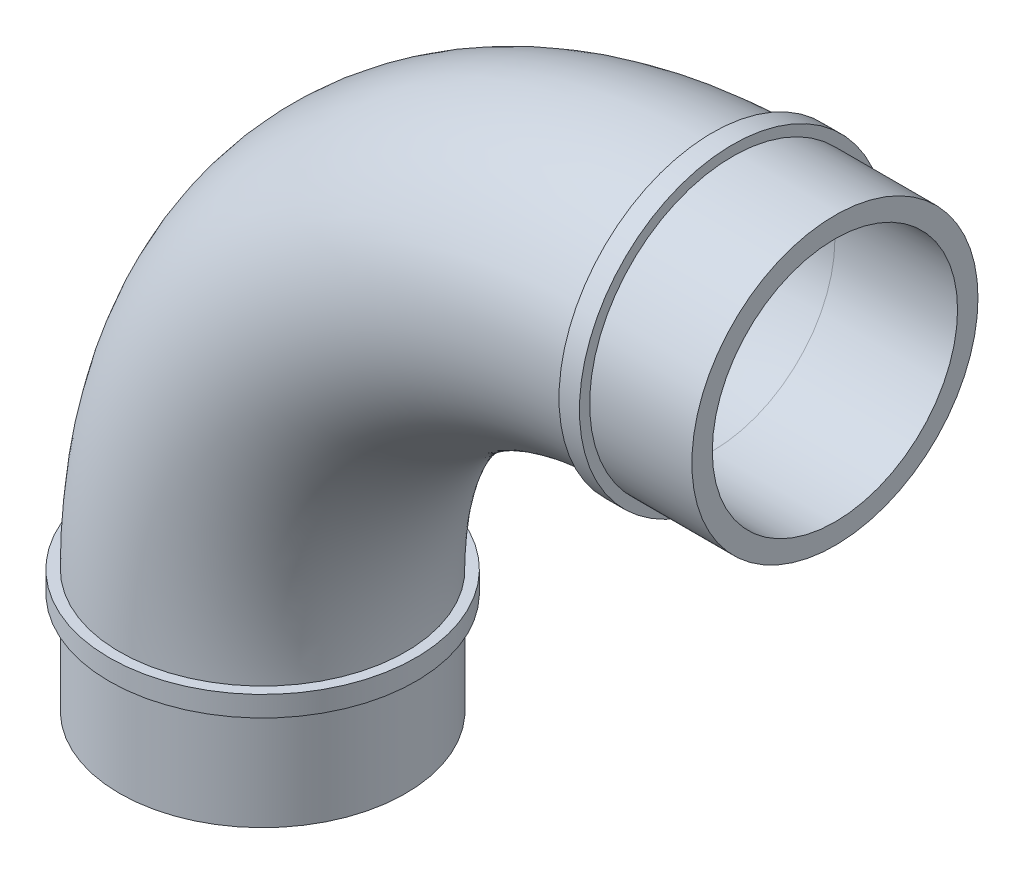
ISO-10303-21;
HEADER;
FILE_DESCRIPTION(('STEP AP214'),'2;1');
FILE_NAME('part.step','',(''),(''),'','','');
FILE_SCHEMA(('AUTOMOTIVE_DESIGN { 1 0 10303 214 1 1 1 1 }'));
ENDSEC;
DATA;
#1=APPLICATION_CONTEXT('core data for automotive mechanical design processes');
#2=APPLICATION_PROTOCOL_DEFINITION('international standard','automotive_design',2000,#1);
#3=PRODUCT_CONTEXT('',#1,'mechanical');
#4=PRODUCT('Part','Part','',(#3));
#5=PRODUCT_RELATED_PRODUCT_CATEGORY('part','',(#4));
#6=PRODUCT_DEFINITION_FORMATION('','',#4);
#7=PRODUCT_DEFINITION_CONTEXT('part definition',#1,'design');
#8=PRODUCT_DEFINITION('design','',#6,#7);
#9=PRODUCT_DEFINITION_SHAPE('','',#8);
#10=(LENGTH_UNIT() NAMED_UNIT(*) SI_UNIT(.MILLI.,.METRE.));
#11=(NAMED_UNIT(*) PLANE_ANGLE_UNIT() SI_UNIT($,.RADIAN.));
#12=(NAMED_UNIT(*) SI_UNIT($,.STERADIAN.) SOLID_ANGLE_UNIT());
#13=UNCERTAINTY_MEASURE_WITH_UNIT(LENGTH_MEASURE(1.E-05),#10,'distance_accuracy_value','');
#14=(GEOMETRIC_REPRESENTATION_CONTEXT(3) GLOBAL_UNCERTAINTY_ASSIGNED_CONTEXT((#13)) GLOBAL_UNIT_ASSIGNED_CONTEXT((#10,
#11,#12)) REPRESENTATION_CONTEXT('',''));
#15=CARTESIAN_POINT('',(0.,0.,0.));
#16=DIRECTION('',(0.,0.,1.));
#17=DIRECTION('',(1.,0.,0.));
#18=AXIS2_PLACEMENT_3D('',#15,#16,#17);
#19=CARTESIAN_POINT('',(0.,1.,0.));
#20=DIRECTION('',(0.,-1.,0.));
#21=DIRECTION('',(0.,0.,-1.));
#22=AXIS2_PLACEMENT_3D('',#19,#20,#21);
#23=CYLINDRICAL_SURFACE('',#22,7.);
#24=CARTESIAN_POINT('',(0.,0.,0.));
#25=DIRECTION('',(0.,1.,0.));
#26=DIRECTION('',(0.,0.,1.));
#27=AXIS2_PLACEMENT_3D('',#24,#25,#26);
#28=CIRCLE('',#27,7.);
#29=CARTESIAN_POINT('',(0.,0.,7.));
#30=VERTEX_POINT('',#29);
#31=EDGE_CURVE('E37',#30,#30,#28,.T.);
#32=ORIENTED_EDGE('',*,*,#31,.T.);
#33=EDGE_LOOP('',(#32));
#34=FACE_BOUND('',#33,.T.);
#35=CARTESIAN_POINT('',(0.,5.,0.));
#36=DIRECTION('',(0.,1.,0.));
#37=DIRECTION('',(0.,0.,1.));
#38=AXIS2_PLACEMENT_3D('',#35,#36,#37);
#39=CIRCLE('',#38,7.);
#40=CARTESIAN_POINT('',(0.,5.,7.));
#41=VERTEX_POINT('',#40);
#42=EDGE_CURVE('E64',#41,#41,#39,.T.);
#43=ORIENTED_EDGE('',*,*,#42,.F.);
#44=EDGE_LOOP('',(#43));
#45=FACE_BOUND('',#44,.T.);
#46=ADVANCED_FACE('F34',(#34,#45),#23,.T.);
#47=CARTESIAN_POINT('',(0.,0.,0.));
#48=DIRECTION('',(0.,1.,0.));
#49=DIRECTION('',(0.,0.,1.));
#50=AXIS2_PLACEMENT_3D('',#47,#48,#49);
#51=PLANE('',#50);
#52=CARTESIAN_POINT('',(0.,0.,0.));
#53=DIRECTION('',(0.,1.,0.));
#54=DIRECTION('',(0.,0.,1.));
#55=AXIS2_PLACEMENT_3D('',#52,#53,#54);
#56=CIRCLE('',#55,6.);
#57=CARTESIAN_POINT('',(0.,0.,6.));
#58=VERTEX_POINT('',#57);
#59=EDGE_CURVE('E131',#58,#58,#56,.F.);
#60=ORIENTED_EDGE('',*,*,#59,.F.);
#61=EDGE_LOOP('',(#60));
#62=FACE_BOUND('',#61,.T.);
#63=ORIENTED_EDGE('',*,*,#31,.F.);
#64=EDGE_LOOP('',(#63));
#65=FACE_BOUND('',#64,.T.);
#66=ADVANCED_FACE('F74',(#62,#65),#51,.F.);
#67=CARTESIAN_POINT('',(0.,6.,0.));
#68=DIRECTION('',(0.,-1.,0.));
#69=DIRECTION('',(0.,0.,-1.));
#70=AXIS2_PLACEMENT_3D('',#67,#68,#69);
#71=CYLINDRICAL_SURFACE('',#70,7.5);
#72=CARTESIAN_POINT('',(0.,6.,0.));
#73=DIRECTION('',(0.,1.,0.));
#74=DIRECTION('',(0.,0.,1.));
#75=AXIS2_PLACEMENT_3D('',#72,#73,#74);
#76=CIRCLE('',#75,7.5);
#77=CARTESIAN_POINT('',(0.,6.,7.5));
#78=VERTEX_POINT('',#77);
#79=EDGE_CURVE('E61',#78,#78,#76,.T.);
#80=ORIENTED_EDGE('',*,*,#79,.F.);
#81=EDGE_LOOP('',(#80));
#82=FACE_BOUND('',#81,.T.);
#83=CARTESIAN_POINT('',(0.,5.,0.));
#84=DIRECTION('',(0.,1.,0.));
#85=DIRECTION('',(0.,0.,1.));
#86=AXIS2_PLACEMENT_3D('',#83,#84,#85);
#87=CIRCLE('',#86,7.5);
#88=CARTESIAN_POINT('',(0.,5.,7.5));
#89=VERTEX_POINT('',#88);
#90=EDGE_CURVE('E60',#89,#89,#87,.T.);
#91=ORIENTED_EDGE('',*,*,#90,.T.);
#92=EDGE_LOOP('',(#91));
#93=FACE_BOUND('',#92,.T.);
#94=ADVANCED_FACE('F76',(#82,#93),#71,.T.);
#95=CARTESIAN_POINT('',(0.,6.,0.));
#96=DIRECTION('',(0.,1.,0.));
#97=DIRECTION('',(0.,0.,1.));
#98=AXIS2_PLACEMENT_3D('',#95,#96,#97);
#99=PLANE('',#98);
#100=CARTESIAN_POINT('',(0.,6.,0.));
#101=DIRECTION('',(0.,1.,0.));
#102=DIRECTION('',(0.,0.,1.));
#103=AXIS2_PLACEMENT_3D('',#100,#101,#102);
#104=CIRCLE('',#103,7.);
#105=CARTESIAN_POINT('',(-7.,6.,0.));
#106=VERTEX_POINT('',#105);
#107=EDGE_CURVE('E41',#106,#106,#104,.T.);
#108=ORIENTED_EDGE('',*,*,#107,.F.);
#109=EDGE_LOOP('',(#108));
#110=FACE_BOUND('',#109,.T.);
#111=ORIENTED_EDGE('',*,*,#79,.T.);
#112=EDGE_LOOP('',(#111));
#113=FACE_BOUND('',#112,.T.);
#114=ADVANCED_FACE('F82',(#110,#113),#99,.T.);
#115=CARTESIAN_POINT('',(0.,5.,0.));
#116=DIRECTION('',(0.,1.,0.));
#117=DIRECTION('',(0.,0.,1.));
#118=AXIS2_PLACEMENT_3D('',#115,#116,#117);
#119=PLANE('',#118);
#120=ORIENTED_EDGE('',*,*,#42,.T.);
#121=EDGE_LOOP('',(#120));
#122=FACE_BOUND('',#121,.T.);
#123=ORIENTED_EDGE('',*,*,#90,.F.);
#124=EDGE_LOOP('',(#123));
#125=FACE_BOUND('',#124,.T.);
#126=ADVANCED_FACE('F87',(#122,#125),#119,.F.);
#127=CARTESIAN_POINT('',(22.,6.,0.));
#128=DIRECTION('',(0.,0.,-1.));
#129=DIRECTION('',(-1.,0.,0.));
#130=AXIS2_PLACEMENT_3D('',#127,#128,#129);
#131=TOROIDAL_SURFACE('',#130,22.,7.);
#132=CARTESIAN_POINT('',(22.,28.,0.));
#133=DIRECTION('',(1.,0.,0.));
#134=DIRECTION('',(0.,0.,1.));
#135=AXIS2_PLACEMENT_3D('',#132,#133,#134);
#136=CIRCLE('',#135,7.);
#137=CARTESIAN_POINT('',(22.,35.,0.));
#138=VERTEX_POINT('',#137);
#139=EDGE_CURVE('E54',#138,#138,#136,.T.);
#140=CARTESIAN_POINT('',(22.,6.,0.));
#141=DIRECTION('',(0.,0.,-1.));
#142=DIRECTION('',(-1.,0.,0.));
#143=AXIS2_PLACEMENT_3D('',#140,#141,#142);
#144=CIRCLE('',#143,29.);
#145=EDGE_CURVE('',#106,#138,#144,.T.);
#146=ORIENTED_EDGE('',*,*,#107,.T.);
#147=ORIENTED_EDGE('',*,*,#139,.F.);
#148=ORIENTED_EDGE('',*,*,#145,.T.);
#149=ORIENTED_EDGE('',*,*,#145,.F.);
#150=EDGE_LOOP('',(#146,#148,#147,#149));
#151=FACE_BOUND('',#150,.T.);
#152=ADVANCED_FACE('F90',(#151),#131,.T.);
#153=CARTESIAN_POINT('',(23.,28.,0.));
#154=DIRECTION('',(-1.,0.,0.));
#155=DIRECTION('',(0.,0.,1.));
#156=AXIS2_PLACEMENT_3D('',#153,#154,#155);
#157=CYLINDRICAL_SURFACE('',#156,7.5);
#158=CARTESIAN_POINT('',(23.,28.,0.));
#159=DIRECTION('',(1.,0.,0.));
#160=DIRECTION('',(0.,0.,-1.));
#161=AXIS2_PLACEMENT_3D('',#158,#159,#160);
#162=CIRCLE('',#161,7.5);
#163=CARTESIAN_POINT('',(23.,28.,-7.5));
#164=VERTEX_POINT('',#163);
#165=EDGE_CURVE('E51',#164,#164,#162,.T.);
#166=ORIENTED_EDGE('',*,*,#165,.F.);
#167=EDGE_LOOP('',(#166));
#168=FACE_BOUND('',#167,.T.);
#169=CARTESIAN_POINT('',(22.,28.,0.));
#170=DIRECTION('',(1.,0.,0.));
#171=DIRECTION('',(0.,0.,-1.));
#172=AXIS2_PLACEMENT_3D('',#169,#170,#171);
#173=CIRCLE('',#172,7.5);
#174=CARTESIAN_POINT('',(22.,28.,-7.5));
#175=VERTEX_POINT('',#174);
#176=EDGE_CURVE('E55',#175,#175,#173,.T.);
#177=ORIENTED_EDGE('',*,*,#176,.T.);
#178=EDGE_LOOP('',(#177));
#179=FACE_BOUND('',#178,.T.);
#180=ADVANCED_FACE('F96',(#168,#179),#157,.T.);
#181=CARTESIAN_POINT('',(23.,28.,0.));
#182=DIRECTION('',(1.,0.,0.));
#183=DIRECTION('',(0.,0.,-1.));
#184=AXIS2_PLACEMENT_3D('',#181,#182,#183);
#185=PLANE('',#184);
#186=CARTESIAN_POINT('',(23.,28.,0.));
#187=DIRECTION('',(1.,0.,0.));
#188=DIRECTION('',(0.,0.,-1.));
#189=AXIS2_PLACEMENT_3D('',#186,#187,#188);
#190=CIRCLE('',#189,7.);
#191=CARTESIAN_POINT('',(23.,28.,-7.));
#192=VERTEX_POINT('',#191);
#193=EDGE_CURVE('E10',#192,#192,#190,.T.);
#194=ORIENTED_EDGE('',*,*,#193,.F.);
#195=EDGE_LOOP('',(#194));
#196=FACE_BOUND('',#195,.T.);
#197=ORIENTED_EDGE('',*,*,#165,.T.);
#198=EDGE_LOOP('',(#197));
#199=FACE_BOUND('',#198,.T.);
#200=ADVANCED_FACE('F100',(#196,#199),#185,.T.);
#201=CARTESIAN_POINT('',(22.,28.,0.));
#202=DIRECTION('',(1.,0.,0.));
#203=DIRECTION('',(0.,0.,-1.));
#204=AXIS2_PLACEMENT_3D('',#201,#202,#203);
#205=PLANE('',#204);
#206=ORIENTED_EDGE('',*,*,#139,.T.);
#207=EDGE_LOOP('',(#206));
#208=FACE_BOUND('',#207,.T.);
#209=ORIENTED_EDGE('',*,*,#176,.F.);
#210=EDGE_LOOP('',(#209));
#211=FACE_BOUND('',#210,.T.);
#212=ADVANCED_FACE('F102',(#208,#211),#205,.F.);
#213=CARTESIAN_POINT('',(27.,28.,0.));
#214=DIRECTION('',(-1.,0.,0.));
#215=DIRECTION('',(0.,0.,1.));
#216=AXIS2_PLACEMENT_3D('',#213,#214,#215);
#217=CYLINDRICAL_SURFACE('',#216,7.);
#218=ORIENTED_EDGE('',*,*,#193,.T.);
#219=EDGE_LOOP('',(#218));
#220=FACE_BOUND('',#219,.T.);
#221=CARTESIAN_POINT('',(28.,28.,0.));
#222=DIRECTION('',(1.,0.,0.));
#223=DIRECTION('',(0.,0.,-1.));
#224=AXIS2_PLACEMENT_3D('',#221,#222,#223);
#225=CIRCLE('',#224,7.);
#226=CARTESIAN_POINT('',(28.,28.,-7.));
#227=VERTEX_POINT('',#226);
#228=EDGE_CURVE('E49',#227,#227,#225,.T.);
#229=ORIENTED_EDGE('',*,*,#228,.F.);
#230=EDGE_LOOP('',(#229));
#231=FACE_BOUND('',#230,.T.);
#232=ADVANCED_FACE('F105',(#220,#231),#217,.T.);
#233=CARTESIAN_POINT('',(28.,28.,0.));
#234=DIRECTION('',(1.,0.,0.));
#235=DIRECTION('',(0.,0.,-1.));
#236=AXIS2_PLACEMENT_3D('',#233,#234,#235);
#237=PLANE('',#236);
#238=CARTESIAN_POINT('',(28.,28.,0.));
#239=DIRECTION('',(1.,0.,0.));
#240=DIRECTION('',(0.,0.,-1.));
#241=AXIS2_PLACEMENT_3D('',#238,#239,#240);
#242=CIRCLE('',#241,6.);
#243=CARTESIAN_POINT('',(28.,28.,-6.));
#244=VERTEX_POINT('',#243);
#245=EDGE_CURVE('E139',#244,#244,#242,.F.);
#246=ORIENTED_EDGE('',*,*,#245,.T.);
#247=EDGE_LOOP('',(#246));
#248=FACE_BOUND('',#247,.T.);
#249=ORIENTED_EDGE('',*,*,#228,.T.);
#250=EDGE_LOOP('',(#249));
#251=FACE_BOUND('',#250,.T.);
#252=ADVANCED_FACE('F112',(#248,#251),#237,.T.);
#253=CARTESIAN_POINT('',(29.,28.,0.));
#254=DIRECTION('',(-1.,0.,0.));
#255=DIRECTION('',(0.,0.,1.));
#256=AXIS2_PLACEMENT_3D('',#253,#254,#255);
#257=CYLINDRICAL_SURFACE('',#256,6.);
#258=CARTESIAN_POINT('',(22.0000000000002,28.,0.));
#259=DIRECTION('',(-1.,0.,0.));
#260=DIRECTION('',(0.,0.,-1.));
#261=AXIS2_PLACEMENT_3D('',#258,#259,#260);
#262=CIRCLE('',#261,6.);
#263=CARTESIAN_POINT('',(22.0000000000002,34.,0.));
#264=VERTEX_POINT('',#263);
#265=EDGE_CURVE('E135',#264,#264,#262,.T.);
#266=ORIENTED_EDGE('',*,*,#265,.T.);
#267=EDGE_LOOP('',(#266));
#268=FACE_BOUND('',#267,.T.);
#269=ORIENTED_EDGE('',*,*,#245,.F.);
#270=EDGE_LOOP('',(#269));
#271=FACE_BOUND('',#270,.T.);
#272=ADVANCED_FACE('F115',(#268,#271),#257,.F.);
#273=CARTESIAN_POINT('',(22.,6.,0.));
#274=DIRECTION('',(0.,0.,1.));
#275=DIRECTION('',(1.,0.,0.));
#276=AXIS2_PLACEMENT_3D('',#273,#274,#275);
#277=TOROIDAL_SURFACE('',#276,22.,6.);
#278=CARTESIAN_POINT('',(0.,6.,0.));
#279=DIRECTION('',(0.,-1.,0.));
#280=DIRECTION('',(0.,0.,-1.));
#281=AXIS2_PLACEMENT_3D('',#278,#279,#280);
#282=CIRCLE('',#281,6.);
#283=CARTESIAN_POINT('',(-6.,6.,0.));
#284=VERTEX_POINT('',#283);
#285=EDGE_CURVE('E134',#284,#284,#282,.T.);
#286=CARTESIAN_POINT('',(22.,6.,0.));
#287=DIRECTION('',(0.,0.,1.));
#288=DIRECTION('',(1.,0.,0.));
#289=AXIS2_PLACEMENT_3D('',#286,#287,#288);
#290=CIRCLE('',#289,28.);
#291=EDGE_CURVE('',#264,#284,#290,.T.);
#292=ORIENTED_EDGE('',*,*,#265,.F.);
#293=ORIENTED_EDGE('',*,*,#285,.T.);
#294=ORIENTED_EDGE('',*,*,#291,.T.);
#295=ORIENTED_EDGE('',*,*,#291,.F.);
#296=EDGE_LOOP('',(#292,#294,#293,#295));
#297=FACE_BOUND('',#296,.T.);
#298=ADVANCED_FACE('F119',(#297),#277,.F.);
#299=CARTESIAN_POINT('',(0.,5.99999999999993,0.));
#300=DIRECTION('',(0.,-1.,0.));
#301=DIRECTION('',(0.,0.,-1.));
#302=AXIS2_PLACEMENT_3D('',#299,#300,#301);
#303=CYLINDRICAL_SURFACE('',#302,6.);
#304=ORIENTED_EDGE('',*,*,#59,.T.);
#305=EDGE_LOOP('',(#304));
#306=FACE_BOUND('',#305,.T.);
#307=ORIENTED_EDGE('',*,*,#285,.F.);
#308=EDGE_LOOP('',(#307));
#309=FACE_BOUND('',#308,.T.);
#310=ADVANCED_FACE('F121',(#306,#309),#303,.F.);
#311=CLOSED_SHELL('',(#46,#66,#94,#114,#126,#152,#180,#200,#212,#232,#252,#272,#298,#310));
#312=MANIFOLD_SOLID_BREP('B2',#311);
#313=ADVANCED_BREP_SHAPE_REPRESENTATION('',(#18,#312),#14);
#314=SHAPE_DEFINITION_REPRESENTATION(#9,#313);
ENDSEC;
END-ISO-10303-21;
